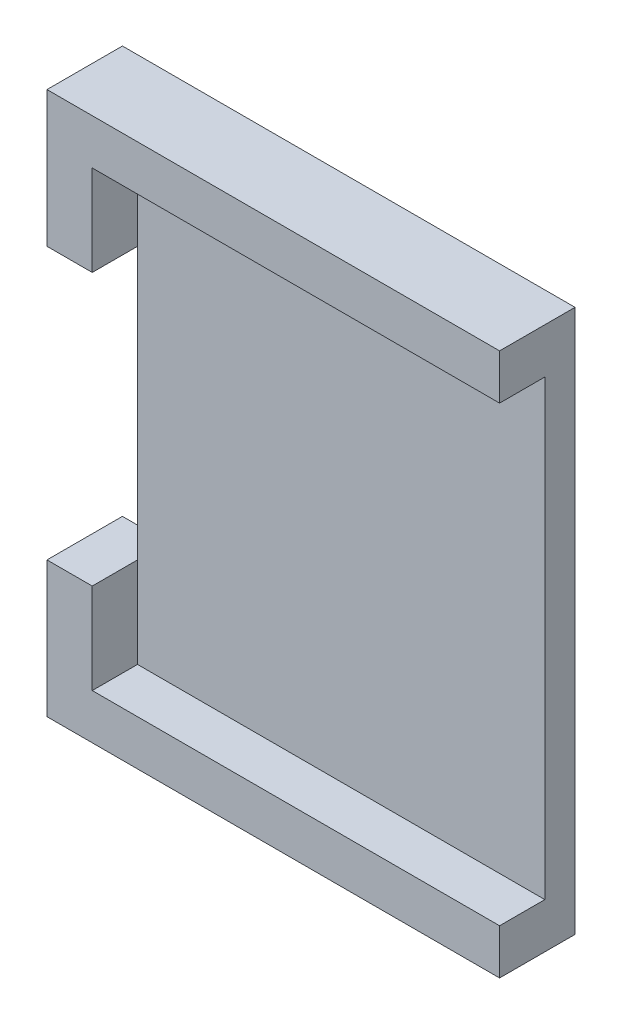
ISO-10303-21;
HEADER;
FILE_DESCRIPTION(('STEP AP214'),'2;1');
FILE_NAME('part.step','',(''),(''),'','','');
FILE_SCHEMA(('AUTOMOTIVE_DESIGN { 1 0 10303 214 1 1 1 1 }'));
ENDSEC;
DATA;
#1=APPLICATION_CONTEXT('core data for automotive mechanical design processes');
#2=APPLICATION_PROTOCOL_DEFINITION('international standard','automotive_design',2000,#1);
#3=PRODUCT_CONTEXT('',#1,'mechanical');
#4=PRODUCT('Part','Part','',(#3));
#5=PRODUCT_RELATED_PRODUCT_CATEGORY('part','',(#4));
#6=PRODUCT_DEFINITION_FORMATION('','',#4);
#7=PRODUCT_DEFINITION_CONTEXT('part definition',#1,'design');
#8=PRODUCT_DEFINITION('design','',#6,#7);
#9=PRODUCT_DEFINITION_SHAPE('','',#8);
#10=(LENGTH_UNIT() NAMED_UNIT(*) SI_UNIT(.MILLI.,.METRE.));
#11=(NAMED_UNIT(*) PLANE_ANGLE_UNIT() SI_UNIT($,.RADIAN.));
#12=(NAMED_UNIT(*) SI_UNIT($,.STERADIAN.) SOLID_ANGLE_UNIT());
#13=UNCERTAINTY_MEASURE_WITH_UNIT(LENGTH_MEASURE(1.E-05),#10,'distance_accuracy_value','');
#14=(GEOMETRIC_REPRESENTATION_CONTEXT(3) GLOBAL_UNCERTAINTY_ASSIGNED_CONTEXT((#13)) GLOBAL_UNIT_ASSIGNED_CONTEXT((#10,
#11,#12)) REPRESENTATION_CONTEXT('',''));
#15=CARTESIAN_POINT('',(0.,0.,0.));
#16=DIRECTION('',(0.,0.,1.));
#17=DIRECTION('',(1.,0.,0.));
#18=AXIS2_PLACEMENT_3D('',#15,#16,#17);
#19=CARTESIAN_POINT('',(0.,0.,2.));
#20=DIRECTION('',(0.,0.,1.));
#21=DIRECTION('',(1.,0.,0.));
#22=AXIS2_PLACEMENT_3D('',#19,#20,#21);
#23=PLANE('',#22);
#24=DIRECTION('',(0.,-1.,0.));
#25=VECTOR('',#24,1.);
#26=CARTESIAN_POINT('',(-12.,0.,2.));
#27=LINE('',#26,#25);
#28=CARTESIAN_POINT('',(-12.,-9.,2.));
#29=VERTEX_POINT('',#28);
#30=CARTESIAN_POINT('',(-12.,-15.,2.));
#31=VERTEX_POINT('',#30);
#32=EDGE_CURVE('E167',#29,#31,#27,.T.);
#33=ORIENTED_EDGE('',*,*,#32,.T.);
#34=DIRECTION('',(1.,0.,0.));
#35=VECTOR('',#34,1.);
#36=CARTESIAN_POINT('',(0.,-15.,2.));
#37=LINE('',#36,#35);
#38=CARTESIAN_POINT('',(15.,-15.,2.));
#39=VERTEX_POINT('',#38);
#40=EDGE_CURVE('E170',#31,#39,#37,.T.);
#41=ORIENTED_EDGE('',*,*,#40,.T.);
#42=DIRECTION('',(0.,-1.,0.));
#43=VECTOR('',#42,1.);
#44=CARTESIAN_POINT('',(15.,0.,2.));
#45=LINE('',#44,#43);
#46=CARTESIAN_POINT('',(15.,15.,2.));
#47=VERTEX_POINT('',#46);
#48=EDGE_CURVE('E55',#47,#39,#45,.T.);
#49=ORIENTED_EDGE('',*,*,#48,.F.);
#50=DIRECTION('',(1.,0.,0.));
#51=VECTOR('',#50,1.);
#52=CARTESIAN_POINT('',(0.,15.,2.));
#53=LINE('',#52,#51);
#54=CARTESIAN_POINT('',(-12.,15.,2.));
#55=VERTEX_POINT('',#54);
#56=EDGE_CURVE('E50',#55,#47,#53,.T.);
#57=ORIENTED_EDGE('',*,*,#56,.F.);
#58=DIRECTION('',(0.,1.,0.));
#59=VECTOR('',#58,1.);
#60=CARTESIAN_POINT('',(-12.,0.,2.));
#61=LINE('',#60,#59);
#62=CARTESIAN_POINT('',(-12.,9.,2.));
#63=VERTEX_POINT('',#62);
#64=EDGE_CURVE('E199',#63,#55,#61,.T.);
#65=ORIENTED_EDGE('',*,*,#64,.F.);
#66=DIRECTION('',(0.,1.,0.));
#67=VECTOR('',#66,1.);
#68=CARTESIAN_POINT('',(-12.,0.,2.));
#69=LINE('',#68,#67);
#70=EDGE_CURVE('E203',#29,#63,#69,.T.);
#71=ORIENTED_EDGE('',*,*,#70,.F.);
#72=EDGE_LOOP('',(#33,#41,#49,#57,#65,#71));
#73=FACE_BOUND('',#72,.T.);
#74=ADVANCED_FACE('F35',(#73),#23,.T.);
#75=CARTESIAN_POINT('',(0.,-9.,2.));
#76=DIRECTION('',(0.,1.,0.));
#77=DIRECTION('',(0.,0.,1.));
#78=AXIS2_PLACEMENT_3D('',#75,#76,#77);
#79=PLANE('',#78);
#80=DIRECTION('',(1.,0.,0.));
#81=VECTOR('',#80,1.);
#82=CARTESIAN_POINT('',(0.,-9.,0.));
#83=LINE('',#82,#81);
#84=CARTESIAN_POINT('',(-15.,-9.,0.));
#85=VERTEX_POINT('',#84);
#86=CARTESIAN_POINT('',(-12.,-9.,0.));
#87=VERTEX_POINT('',#86);
#88=EDGE_CURVE('E201',#85,#87,#83,.T.);
#89=ORIENTED_EDGE('',*,*,#88,.F.);
#90=DIRECTION('',(0.,0.,-1.));
#91=VECTOR('',#90,1.);
#92=CARTESIAN_POINT('',(-15.,-9.,2.));
#93=LINE('',#92,#91);
#94=CARTESIAN_POINT('',(-15.,-9.,5.));
#95=VERTEX_POINT('',#94);
#96=EDGE_CURVE('E11',#95,#85,#93,.T.);
#97=ORIENTED_EDGE('',*,*,#96,.F.);
#98=DIRECTION('',(1.,0.,0.));
#99=VECTOR('',#98,1.);
#100=CARTESIAN_POINT('',(0.,-9.,5.));
#101=LINE('',#100,#99);
#102=CARTESIAN_POINT('',(-12.,-9.,5.));
#103=VERTEX_POINT('',#102);
#104=EDGE_CURVE('E151',#95,#103,#101,.T.);
#105=ORIENTED_EDGE('',*,*,#104,.T.);
#106=DIRECTION('',(0.,0.,-1.));
#107=VECTOR('',#106,1.);
#108=CARTESIAN_POINT('',(-12.,-9.,5.));
#109=LINE('',#108,#107);
#110=EDGE_CURVE('E160',#103,#29,#109,.T.);
#111=ORIENTED_EDGE('',*,*,#110,.T.);
#112=DIRECTION('',(0.,0.,-1.));
#113=VECTOR('',#112,1.);
#114=CARTESIAN_POINT('',(-12.,-9.,2.));
#115=LINE('',#114,#113);
#116=EDGE_CURVE('E206',#29,#87,#115,.T.);
#117=ORIENTED_EDGE('',*,*,#116,.T.);
#118=EDGE_LOOP('',(#89,#97,#105,#111,#117));
#119=FACE_BOUND('',#118,.T.);
#120=ADVANCED_FACE('F37',(#119),#79,.T.);
#121=CARTESIAN_POINT('',(-15.,0.,2.));
#122=DIRECTION('',(1.,0.,0.));
#123=DIRECTION('',(0.,0.,-1.));
#124=AXIS2_PLACEMENT_3D('',#121,#122,#123);
#125=PLANE('',#124);
#126=DIRECTION('',(0.,-1.,0.));
#127=VECTOR('',#126,1.);
#128=CARTESIAN_POINT('',(-15.,0.,0.));
#129=LINE('',#128,#127);
#130=CARTESIAN_POINT('',(-15.,-18.,0.));
#131=VERTEX_POINT('',#130);
#132=EDGE_CURVE('E135',#85,#131,#129,.T.);
#133=ORIENTED_EDGE('',*,*,#132,.T.);
#134=DIRECTION('',(0.,0.,-1.));
#135=VECTOR('',#134,1.);
#136=CARTESIAN_POINT('',(-15.,-18.,2.));
#137=LINE('',#136,#135);
#138=CARTESIAN_POINT('',(-15.,-18.,5.));
#139=VERTEX_POINT('',#138);
#140=EDGE_CURVE('E43',#139,#131,#137,.T.);
#141=ORIENTED_EDGE('',*,*,#140,.F.);
#142=DIRECTION('',(0.,-1.,0.));
#143=VECTOR('',#142,1.);
#144=CARTESIAN_POINT('',(-15.,0.,5.));
#145=LINE('',#144,#143);
#146=EDGE_CURVE('E132',#95,#139,#145,.T.);
#147=ORIENTED_EDGE('',*,*,#146,.F.);
#148=ORIENTED_EDGE('',*,*,#96,.T.);
#149=EDGE_LOOP('',(#133,#141,#147,#148));
#150=FACE_BOUND('',#149,.T.);
#151=ADVANCED_FACE('F130',(#150),#125,.F.);
#152=CARTESIAN_POINT('',(0.,-18.,2.));
#153=DIRECTION('',(0.,1.,0.));
#154=DIRECTION('',(0.,0.,1.));
#155=AXIS2_PLACEMENT_3D('',#152,#153,#154);
#156=PLANE('',#155);
#157=DIRECTION('',(1.,0.,0.));
#158=VECTOR('',#157,1.);
#159=CARTESIAN_POINT('',(0.,-18.,0.));
#160=LINE('',#159,#158);
#161=CARTESIAN_POINT('',(15.,-18.,0.));
#162=VERTEX_POINT('',#161);
#163=EDGE_CURVE('E210',#131,#162,#160,.T.);
#164=ORIENTED_EDGE('',*,*,#163,.T.);
#165=DIRECTION('',(0.,0.,-1.));
#166=VECTOR('',#165,1.);
#167=CARTESIAN_POINT('',(15.,-18.,2.));
#168=LINE('',#167,#166);
#169=CARTESIAN_POINT('',(15.,-18.,5.));
#170=VERTEX_POINT('',#169);
#171=EDGE_CURVE('E139',#170,#162,#168,.T.);
#172=ORIENTED_EDGE('',*,*,#171,.F.);
#173=DIRECTION('',(1.,0.,0.));
#174=VECTOR('',#173,1.);
#175=CARTESIAN_POINT('',(0.,-18.,5.));
#176=LINE('',#175,#174);
#177=EDGE_CURVE('E141',#139,#170,#176,.T.);
#178=ORIENTED_EDGE('',*,*,#177,.F.);
#179=ORIENTED_EDGE('',*,*,#140,.T.);
#180=EDGE_LOOP('',(#164,#172,#178,#179));
#181=FACE_BOUND('',#180,.T.);
#182=ADVANCED_FACE('F142',(#181),#156,.F.);
#183=CARTESIAN_POINT('',(15.,0.,2.));
#184=DIRECTION('',(1.,0.,0.));
#185=DIRECTION('',(0.,1.,0.));
#186=AXIS2_PLACEMENT_3D('',#183,#184,#185);
#187=PLANE('',#186);
#188=ORIENTED_EDGE('',*,*,#171,.T.);
#189=DIRECTION('',(0.,-1.,0.));
#190=VECTOR('',#189,1.);
#191=CARTESIAN_POINT('',(15.,0.,0.));
#192=LINE('',#191,#190);
#193=CARTESIAN_POINT('',(15.,18.,0.));
#194=VERTEX_POINT('',#193);
#195=EDGE_CURVE('E212',#194,#162,#192,.T.);
#196=ORIENTED_EDGE('',*,*,#195,.F.);
#197=DIRECTION('',(0.,0.,-1.));
#198=VECTOR('',#197,1.);
#199=CARTESIAN_POINT('',(15.,18.,2.));
#200=LINE('',#199,#198);
#201=CARTESIAN_POINT('',(15.,18.,5.));
#202=VERTEX_POINT('',#201);
#203=EDGE_CURVE('E232',#202,#194,#200,.T.);
#204=ORIENTED_EDGE('',*,*,#203,.F.);
#205=DIRECTION('',(0.,1.,0.));
#206=VECTOR('',#205,1.);
#207=CARTESIAN_POINT('',(15.,0.,5.));
#208=LINE('',#207,#206);
#209=CARTESIAN_POINT('',(15.,15.,5.));
#210=VERTEX_POINT('',#209);
#211=EDGE_CURVE('E178',#210,#202,#208,.T.);
#212=ORIENTED_EDGE('',*,*,#211,.F.);
#213=DIRECTION('',(0.,0.,-1.));
#214=VECTOR('',#213,1.);
#215=CARTESIAN_POINT('',(15.,15.,5.));
#216=LINE('',#215,#214);
#217=EDGE_CURVE('E192',#210,#47,#216,.T.);
#218=ORIENTED_EDGE('',*,*,#217,.T.);
#219=ORIENTED_EDGE('',*,*,#48,.T.);
#220=DIRECTION('',(0.,0.,-1.));
#221=VECTOR('',#220,1.);
#222=CARTESIAN_POINT('',(15.,-15.,5.));
#223=LINE('',#222,#221);
#224=CARTESIAN_POINT('',(15.,-15.,5.));
#225=VERTEX_POINT('',#224);
#226=EDGE_CURVE('E165',#225,#39,#223,.T.);
#227=ORIENTED_EDGE('',*,*,#226,.F.);
#228=DIRECTION('',(0.,-1.,0.));
#229=VECTOR('',#228,1.);
#230=CARTESIAN_POINT('',(15.,0.,5.));
#231=LINE('',#230,#229);
#232=EDGE_CURVE('E147',#225,#170,#231,.T.);
#233=ORIENTED_EDGE('',*,*,#232,.T.);
#234=EDGE_LOOP('',(#188,#196,#204,#212,#218,#219,#227,#233));
#235=FACE_BOUND('',#234,.T.);
#236=ADVANCED_FACE('F236',(#235),#187,.T.);
#237=CARTESIAN_POINT('',(0.,18.,2.));
#238=DIRECTION('',(0.,-1.,0.));
#239=DIRECTION('',(0.,0.,-1.));
#240=AXIS2_PLACEMENT_3D('',#237,#238,#239);
#241=PLANE('',#240);
#242=DIRECTION('',(-1.,0.,0.));
#243=VECTOR('',#242,1.);
#244=CARTESIAN_POINT('',(0.,18.,0.));
#245=LINE('',#244,#243);
#246=CARTESIAN_POINT('',(-15.,18.,0.));
#247=VERTEX_POINT('',#246);
#248=EDGE_CURVE('E214',#194,#247,#245,.T.);
#249=ORIENTED_EDGE('',*,*,#248,.T.);
#250=DIRECTION('',(0.,0.,-1.));
#251=VECTOR('',#250,1.);
#252=CARTESIAN_POINT('',(-15.,18.,2.));
#253=LINE('',#252,#251);
#254=CARTESIAN_POINT('',(-15.,18.,5.));
#255=VERTEX_POINT('',#254);
#256=EDGE_CURVE('E230',#255,#247,#253,.T.);
#257=ORIENTED_EDGE('',*,*,#256,.F.);
#258=DIRECTION('',(-1.,0.,0.));
#259=VECTOR('',#258,1.);
#260=CARTESIAN_POINT('',(0.,18.,5.));
#261=LINE('',#260,#259);
#262=EDGE_CURVE('E181',#202,#255,#261,.T.);
#263=ORIENTED_EDGE('',*,*,#262,.F.);
#264=ORIENTED_EDGE('',*,*,#203,.T.);
#265=EDGE_LOOP('',(#249,#257,#263,#264));
#266=FACE_BOUND('',#265,.T.);
#267=ADVANCED_FACE('F244',(#266),#241,.F.);
#268=CARTESIAN_POINT('',(-15.,0.,2.));
#269=DIRECTION('',(-1.,0.,0.));
#270=DIRECTION('',(0.,0.,1.));
#271=AXIS2_PLACEMENT_3D('',#268,#269,#270);
#272=PLANE('',#271);
#273=DIRECTION('',(0.,1.,0.));
#274=VECTOR('',#273,1.);
#275=CARTESIAN_POINT('',(-15.,0.,0.));
#276=LINE('',#275,#274);
#277=CARTESIAN_POINT('',(-15.,9.,0.));
#278=VERTEX_POINT('',#277);
#279=EDGE_CURVE('E217',#278,#247,#276,.T.);
#280=ORIENTED_EDGE('',*,*,#279,.F.);
#281=DIRECTION('',(0.,0.,-1.));
#282=VECTOR('',#281,1.);
#283=CARTESIAN_POINT('',(-15.,9.,2.));
#284=LINE('',#283,#282);
#285=CARTESIAN_POINT('',(-15.,9.,5.));
#286=VERTEX_POINT('',#285);
#287=EDGE_CURVE('E228',#286,#278,#284,.T.);
#288=ORIENTED_EDGE('',*,*,#287,.F.);
#289=DIRECTION('',(0.,-1.,0.));
#290=VECTOR('',#289,1.);
#291=CARTESIAN_POINT('',(-15.,0.,5.));
#292=LINE('',#291,#290);
#293=EDGE_CURVE('E184',#255,#286,#292,.T.);
#294=ORIENTED_EDGE('',*,*,#293,.F.);
#295=ORIENTED_EDGE('',*,*,#256,.T.);
#296=EDGE_LOOP('',(#280,#288,#294,#295));
#297=FACE_BOUND('',#296,.T.);
#298=ADVANCED_FACE('F275',(#297),#272,.T.);
#299=CARTESIAN_POINT('',(0.,9.,2.));
#300=DIRECTION('',(0.,1.,0.));
#301=DIRECTION('',(0.,0.,1.));
#302=AXIS2_PLACEMENT_3D('',#299,#300,#301);
#303=PLANE('',#302);
#304=DIRECTION('',(1.,0.,0.));
#305=VECTOR('',#304,1.);
#306=CARTESIAN_POINT('',(0.,9.,0.));
#307=LINE('',#306,#305);
#308=CARTESIAN_POINT('',(-12.,9.,0.));
#309=VERTEX_POINT('',#308);
#310=EDGE_CURVE('E220',#278,#309,#307,.T.);
#311=ORIENTED_EDGE('',*,*,#310,.T.);
#312=DIRECTION('',(0.,0.,-1.));
#313=VECTOR('',#312,1.);
#314=CARTESIAN_POINT('',(-12.,9.,2.));
#315=LINE('',#314,#313);
#316=EDGE_CURVE('E226',#63,#309,#315,.T.);
#317=ORIENTED_EDGE('',*,*,#316,.F.);
#318=DIRECTION('',(0.,0.,-1.));
#319=VECTOR('',#318,1.);
#320=CARTESIAN_POINT('',(-12.,9.,5.));
#321=LINE('',#320,#319);
#322=CARTESIAN_POINT('',(-12.,9.,5.));
#323=VERTEX_POINT('',#322);
#324=EDGE_CURVE('E189',#323,#63,#321,.T.);
#325=ORIENTED_EDGE('',*,*,#324,.F.);
#326=DIRECTION('',(1.,0.,0.));
#327=VECTOR('',#326,1.);
#328=CARTESIAN_POINT('',(0.,9.,5.));
#329=LINE('',#328,#327);
#330=EDGE_CURVE('E187',#286,#323,#329,.T.);
#331=ORIENTED_EDGE('',*,*,#330,.F.);
#332=ORIENTED_EDGE('',*,*,#287,.T.);
#333=EDGE_LOOP('',(#311,#317,#325,#331,#332));
#334=FACE_BOUND('',#333,.T.);
#335=ADVANCED_FACE('F272',(#334),#303,.F.);
#336=CARTESIAN_POINT('',(-12.,0.,2.));
#337=DIRECTION('',(-1.,0.,0.));
#338=DIRECTION('',(0.,0.,1.));
#339=AXIS2_PLACEMENT_3D('',#336,#337,#338);
#340=PLANE('',#339);
#341=DIRECTION('',(0.,1.,0.));
#342=VECTOR('',#341,1.);
#343=CARTESIAN_POINT('',(-12.,0.,0.));
#344=LINE('',#343,#342);
#345=EDGE_CURVE('E204',#87,#309,#344,.T.);
#346=ORIENTED_EDGE('',*,*,#345,.F.);
#347=ORIENTED_EDGE('',*,*,#116,.F.);
#348=ORIENTED_EDGE('',*,*,#70,.T.);
#349=ORIENTED_EDGE('',*,*,#316,.T.);
#350=EDGE_LOOP('',(#346,#347,#348,#349));
#351=FACE_BOUND('',#350,.T.);
#352=ADVANCED_FACE('F267',(#351),#340,.T.);
#353=CARTESIAN_POINT('',(0.,0.,0.));
#354=DIRECTION('',(0.,0.,1.));
#355=DIRECTION('',(1.,0.,0.));
#356=AXIS2_PLACEMENT_3D('',#353,#354,#355);
#357=PLANE('',#356);
#358=ORIENTED_EDGE('',*,*,#195,.T.);
#359=ORIENTED_EDGE('',*,*,#163,.F.);
#360=ORIENTED_EDGE('',*,*,#132,.F.);
#361=ORIENTED_EDGE('',*,*,#88,.T.);
#362=ORIENTED_EDGE('',*,*,#345,.T.);
#363=ORIENTED_EDGE('',*,*,#310,.F.);
#364=ORIENTED_EDGE('',*,*,#279,.T.);
#365=ORIENTED_EDGE('',*,*,#248,.F.);
#366=EDGE_LOOP('',(#358,#359,#360,#361,#362,#363,#364,#365));
#367=FACE_BOUND('',#366,.T.);
#368=ADVANCED_FACE('F238',(#367),#357,.F.);
#369=CARTESIAN_POINT('',(-12.,0.,5.));
#370=DIRECTION('',(1.,0.,0.));
#371=DIRECTION('',(0.,0.,-1.));
#372=AXIS2_PLACEMENT_3D('',#369,#370,#371);
#373=PLANE('',#372);
#374=ORIENTED_EDGE('',*,*,#324,.T.);
#375=ORIENTED_EDGE('',*,*,#64,.T.);
#376=DIRECTION('',(0.,0.,-1.));
#377=VECTOR('',#376,1.);
#378=CARTESIAN_POINT('',(-12.,15.,5.));
#379=LINE('',#378,#377);
#380=CARTESIAN_POINT('',(-12.,15.,5.));
#381=VERTEX_POINT('',#380);
#382=EDGE_CURVE('E195',#381,#55,#379,.T.);
#383=ORIENTED_EDGE('',*,*,#382,.F.);
#384=DIRECTION('',(0.,-1.,0.));
#385=VECTOR('',#384,1.);
#386=CARTESIAN_POINT('',(-12.,0.,5.));
#387=LINE('',#386,#385);
#388=EDGE_CURVE('E172',#381,#323,#387,.T.);
#389=ORIENTED_EDGE('',*,*,#388,.T.);
#390=EDGE_LOOP('',(#374,#375,#383,#389));
#391=FACE_BOUND('',#390,.T.);
#392=ADVANCED_FACE('F277',(#391),#373,.T.);
#393=CARTESIAN_POINT('',(0.,15.,5.));
#394=DIRECTION('',(0.,-1.,0.));
#395=DIRECTION('',(0.,0.,-1.));
#396=AXIS2_PLACEMENT_3D('',#393,#394,#395);
#397=PLANE('',#396);
#398=ORIENTED_EDGE('',*,*,#382,.T.);
#399=ORIENTED_EDGE('',*,*,#56,.T.);
#400=ORIENTED_EDGE('',*,*,#217,.F.);
#401=DIRECTION('',(-1.,0.,0.));
#402=VECTOR('',#401,1.);
#403=CARTESIAN_POINT('',(0.,15.,5.));
#404=LINE('',#403,#402);
#405=EDGE_CURVE('E175',#210,#381,#404,.T.);
#406=ORIENTED_EDGE('',*,*,#405,.T.);
#407=EDGE_LOOP('',(#398,#399,#400,#406));
#408=FACE_BOUND('',#407,.T.);
#409=ADVANCED_FACE('F253',(#408),#397,.T.);
#410=CARTESIAN_POINT('',(0.,0.,5.));
#411=DIRECTION('',(0.,0.,1.));
#412=DIRECTION('',(1.,0.,0.));
#413=AXIS2_PLACEMENT_3D('',#410,#411,#412);
#414=PLANE('',#413);
#415=ORIENTED_EDGE('',*,*,#388,.F.);
#416=ORIENTED_EDGE('',*,*,#405,.F.);
#417=ORIENTED_EDGE('',*,*,#211,.T.);
#418=ORIENTED_EDGE('',*,*,#262,.T.);
#419=ORIENTED_EDGE('',*,*,#293,.T.);
#420=ORIENTED_EDGE('',*,*,#330,.T.);
#421=EDGE_LOOP('',(#415,#416,#417,#418,#419,#420));
#422=FACE_BOUND('',#421,.T.);
#423=ADVANCED_FACE('F250',(#422),#414,.T.);
#424=CARTESIAN_POINT('',(0.,-15.,5.));
#425=DIRECTION('',(0.,-1.,0.));
#426=DIRECTION('',(0.,0.,-1.));
#427=AXIS2_PLACEMENT_3D('',#424,#425,#426);
#428=PLANE('',#427);
#429=ORIENTED_EDGE('',*,*,#40,.F.);
#430=DIRECTION('',(0.,0.,-1.));
#431=VECTOR('',#430,1.);
#432=CARTESIAN_POINT('',(-12.,-15.,5.));
#433=LINE('',#432,#431);
#434=CARTESIAN_POINT('',(-12.,-15.,5.));
#435=VERTEX_POINT('',#434);
#436=EDGE_CURVE('E162',#435,#31,#433,.T.);
#437=ORIENTED_EDGE('',*,*,#436,.F.);
#438=DIRECTION('',(-1.,0.,0.));
#439=VECTOR('',#438,1.);
#440=CARTESIAN_POINT('',(0.,-15.,5.));
#441=LINE('',#440,#439);
#442=EDGE_CURVE('E155',#225,#435,#441,.T.);
#443=ORIENTED_EDGE('',*,*,#442,.F.);
#444=ORIENTED_EDGE('',*,*,#226,.T.);
#445=EDGE_LOOP('',(#429,#437,#443,#444));
#446=FACE_BOUND('',#445,.T.);
#447=ADVANCED_FACE('F257',(#446),#428,.F.);
#448=CARTESIAN_POINT('',(-12.,0.,5.));
#449=DIRECTION('',(-1.,0.,0.));
#450=DIRECTION('',(0.,0.,1.));
#451=AXIS2_PLACEMENT_3D('',#448,#449,#450);
#452=PLANE('',#451);
#453=ORIENTED_EDGE('',*,*,#32,.F.);
#454=ORIENTED_EDGE('',*,*,#110,.F.);
#455=DIRECTION('',(0.,1.,0.));
#456=VECTOR('',#455,1.);
#457=CARTESIAN_POINT('',(-12.,0.,5.));
#458=LINE('',#457,#456);
#459=EDGE_CURVE('E157',#435,#103,#458,.T.);
#460=ORIENTED_EDGE('',*,*,#459,.F.);
#461=ORIENTED_EDGE('',*,*,#436,.T.);
#462=EDGE_LOOP('',(#453,#454,#460,#461));
#463=FACE_BOUND('',#462,.T.);
#464=ADVANCED_FACE('F262',(#463),#452,.F.);
#465=CARTESIAN_POINT('',(0.,0.,5.));
#466=DIRECTION('',(0.,0.,1.));
#467=DIRECTION('',(1.,0.,0.));
#468=AXIS2_PLACEMENT_3D('',#465,#466,#467);
#469=PLANE('',#468);
#470=ORIENTED_EDGE('',*,*,#146,.T.);
#471=ORIENTED_EDGE('',*,*,#177,.T.);
#472=ORIENTED_EDGE('',*,*,#232,.F.);
#473=ORIENTED_EDGE('',*,*,#442,.T.);
#474=ORIENTED_EDGE('',*,*,#459,.T.);
#475=ORIENTED_EDGE('',*,*,#104,.F.);
#476=EDGE_LOOP('',(#470,#471,#472,#473,#474,#475));
#477=FACE_BOUND('',#476,.T.);
#478=ADVANCED_FACE('F149',(#477),#469,.T.);
#479=CLOSED_SHELL('',(#74,#120,#151,#182,#236,#267,#298,#335,#352,#368,#392,#409,#423,#447,#464,#478));
#480=MANIFOLD_SOLID_BREP('B2',#479);
#481=ADVANCED_BREP_SHAPE_REPRESENTATION('',(#18,#480),#14);
#482=SHAPE_DEFINITION_REPRESENTATION(#9,#481);
ENDSEC;
END-ISO-10303-21;
